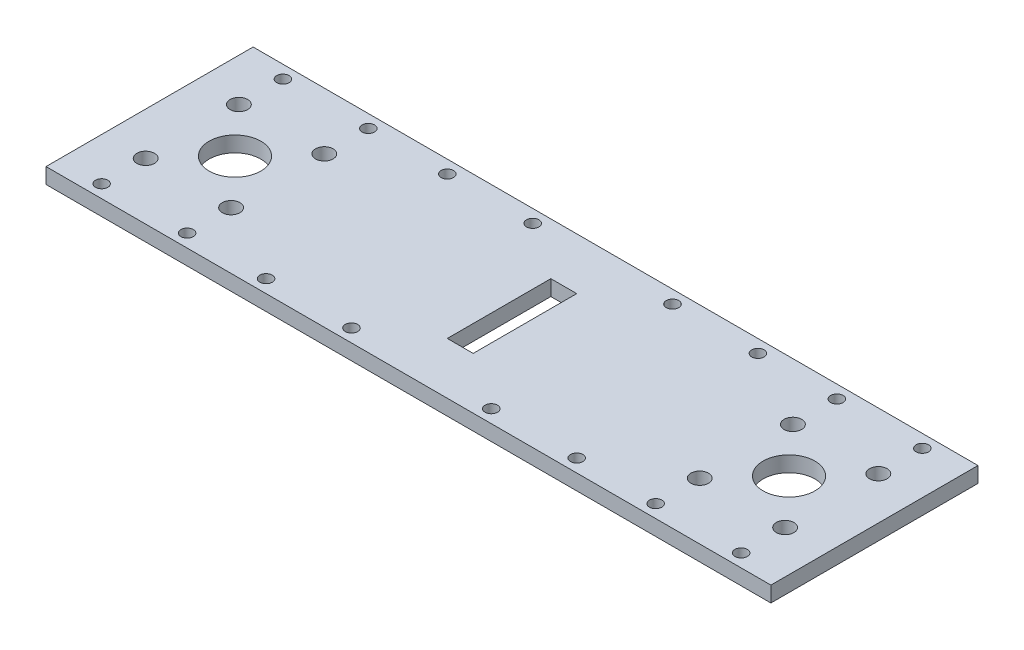
ISO-10303-21;
HEADER;
FILE_DESCRIPTION(('STEP AP214'),'2;1');
FILE_NAME('part.step','',(''),(''),'','','');
FILE_SCHEMA(('AUTOMOTIVE_DESIGN { 1 0 10303 214 1 1 1 1 }'));
ENDSEC;
DATA;
#1=APPLICATION_CONTEXT('core data for automotive mechanical design processes');
#2=APPLICATION_PROTOCOL_DEFINITION('international standard','automotive_design',2000,#1);
#3=PRODUCT_CONTEXT('',#1,'mechanical');
#4=PRODUCT('Part','Part','',(#3));
#5=PRODUCT_RELATED_PRODUCT_CATEGORY('part','',(#4));
#6=PRODUCT_DEFINITION_FORMATION('','',#4);
#7=PRODUCT_DEFINITION_CONTEXT('part definition',#1,'design');
#8=PRODUCT_DEFINITION('design','',#6,#7);
#9=PRODUCT_DEFINITION_SHAPE('','',#8);
#10=(LENGTH_UNIT() NAMED_UNIT(*) SI_UNIT(.MILLI.,.METRE.));
#11=(NAMED_UNIT(*) PLANE_ANGLE_UNIT() SI_UNIT($,.RADIAN.));
#12=(NAMED_UNIT(*) SI_UNIT($,.STERADIAN.) SOLID_ANGLE_UNIT());
#13=UNCERTAINTY_MEASURE_WITH_UNIT(LENGTH_MEASURE(1.E-05),#10,'distance_accuracy_value','');
#14=(GEOMETRIC_REPRESENTATION_CONTEXT(3) GLOBAL_UNCERTAINTY_ASSIGNED_CONTEXT((#13)) GLOBAL_UNIT_ASSIGNED_CONTEXT((#10,
#11,#12)) REPRESENTATION_CONTEXT('',''));
#15=CARTESIAN_POINT('',(0.,0.,0.));
#16=DIRECTION('',(0.,0.,1.));
#17=DIRECTION('',(1.,0.,0.));
#18=AXIS2_PLACEMENT_3D('',#15,#16,#17);
#19=CARTESIAN_POINT('',(0.,3.,-9.99999999999999));
#20=DIRECTION('',(0.,0.,-1.));
#21=DIRECTION('',(-1.,0.,0.));
#22=AXIS2_PLACEMENT_3D('',#19,#20,#21);
#23=PLANE('',#22);
#24=DIRECTION('',(1.,0.,0.));
#25=VECTOR('',#24,1.);
#26=CARTESIAN_POINT('',(0.,0.,-9.99999999999999));
#27=LINE('',#26,#25);
#28=CARTESIAN_POINT('',(-2.50000000000001,0.,-9.99999999999999));
#29=VERTEX_POINT('',#28);
#30=CARTESIAN_POINT('',(2.49999999999999,0.,-9.99999999999999));
#31=VERTEX_POINT('',#30);
#32=EDGE_CURVE('E269',#29,#31,#27,.T.);
#33=ORIENTED_EDGE('',*,*,#32,.T.);
#34=DIRECTION('',(0.,-1.,0.));
#35=VECTOR('',#34,1.);
#36=CARTESIAN_POINT('',(2.49999999999999,3.,-9.99999999999999));
#37=LINE('',#36,#35);
#38=CARTESIAN_POINT('',(2.49999999999999,3.,-9.99999999999999));
#39=VERTEX_POINT('',#38);
#40=EDGE_CURVE('E11',#39,#31,#37,.T.);
#41=ORIENTED_EDGE('',*,*,#40,.F.);
#42=DIRECTION('',(1.,0.,0.));
#43=VECTOR('',#42,1.);
#44=CARTESIAN_POINT('',(0.,3.,-9.99999999999999));
#45=LINE('',#44,#43);
#46=CARTESIAN_POINT('',(-2.50000000000001,3.,-9.99999999999999));
#47=VERTEX_POINT('',#46);
#48=EDGE_CURVE('E129',#47,#39,#45,.T.);
#49=ORIENTED_EDGE('',*,*,#48,.F.);
#50=DIRECTION('',(0.,-1.,0.));
#51=VECTOR('',#50,1.);
#52=CARTESIAN_POINT('',(-2.50000000000001,3.,-9.99999999999999));
#53=LINE('',#52,#51);
#54=EDGE_CURVE('E67',#47,#29,#53,.T.);
#55=ORIENTED_EDGE('',*,*,#54,.T.);
#56=EDGE_LOOP('',(#33,#41,#49,#55));
#57=FACE_BOUND('',#56,.T.);
#58=ADVANCED_FACE('F47',(#57),#23,.F.);
#59=CARTESIAN_POINT('',(2.49999999999999,3.,0.));
#60=DIRECTION('',(1.,0.,0.));
#61=DIRECTION('',(0.,0.,-1.));
#62=AXIS2_PLACEMENT_3D('',#59,#60,#61);
#63=PLANE('',#62);
#64=DIRECTION('',(0.,0.,1.));
#65=VECTOR('',#64,1.);
#66=CARTESIAN_POINT('',(2.49999999999999,0.,0.));
#67=LINE('',#66,#65);
#68=CARTESIAN_POINT('',(2.49999999999999,0.,10.));
#69=VERTEX_POINT('',#68);
#70=EDGE_CURVE('E136',#31,#69,#67,.T.);
#71=ORIENTED_EDGE('',*,*,#70,.T.);
#72=DIRECTION('',(0.,-1.,0.));
#73=VECTOR('',#72,1.);
#74=CARTESIAN_POINT('',(2.49999999999999,3.,10.));
#75=LINE('',#74,#73);
#76=CARTESIAN_POINT('',(2.49999999999999,3.,10.));
#77=VERTEX_POINT('',#76);
#78=EDGE_CURVE('E58',#77,#69,#75,.T.);
#79=ORIENTED_EDGE('',*,*,#78,.F.);
#80=DIRECTION('',(0.,0.,1.));
#81=VECTOR('',#80,1.);
#82=CARTESIAN_POINT('',(2.49999999999999,3.,0.));
#83=LINE('',#82,#81);
#84=EDGE_CURVE('E122',#39,#77,#83,.T.);
#85=ORIENTED_EDGE('',*,*,#84,.F.);
#86=ORIENTED_EDGE('',*,*,#40,.T.);
#87=EDGE_LOOP('',(#71,#79,#85,#86));
#88=FACE_BOUND('',#87,.T.);
#89=ADVANCED_FACE('F135',(#88),#63,.F.);
#90=CARTESIAN_POINT('',(0.,3.,10.));
#91=DIRECTION('',(0.,0.,-1.));
#92=DIRECTION('',(-1.,0.,0.));
#93=AXIS2_PLACEMENT_3D('',#90,#91,#92);
#94=PLANE('',#93);
#95=DIRECTION('',(1.,0.,0.));
#96=VECTOR('',#95,1.);
#97=CARTESIAN_POINT('',(0.,0.,10.));
#98=LINE('',#97,#96);
#99=CARTESIAN_POINT('',(-2.50000000000001,0.,10.));
#100=VERTEX_POINT('',#99);
#101=EDGE_CURVE('E274',#100,#69,#98,.T.);
#102=ORIENTED_EDGE('',*,*,#101,.F.);
#103=DIRECTION('',(0.,-1.,0.));
#104=VECTOR('',#103,1.);
#105=CARTESIAN_POINT('',(-2.50000000000001,3.,10.));
#106=LINE('',#105,#104);
#107=CARTESIAN_POINT('',(-2.50000000000001,3.,10.));
#108=VERTEX_POINT('',#107);
#109=EDGE_CURVE('E93',#108,#100,#106,.T.);
#110=ORIENTED_EDGE('',*,*,#109,.F.);
#111=DIRECTION('',(1.,0.,0.));
#112=VECTOR('',#111,1.);
#113=CARTESIAN_POINT('',(0.,3.,10.));
#114=LINE('',#113,#112);
#115=EDGE_CURVE('E128',#108,#77,#114,.T.);
#116=ORIENTED_EDGE('',*,*,#115,.T.);
#117=ORIENTED_EDGE('',*,*,#78,.T.);
#118=EDGE_LOOP('',(#102,#110,#116,#117));
#119=FACE_BOUND('',#118,.T.);
#120=ADVANCED_FACE('F141',(#119),#94,.T.);
#121=CARTESIAN_POINT('',(0.,3.,20.));
#122=DIRECTION('',(0.,0.,-1.));
#123=DIRECTION('',(-1.,0.,0.));
#124=AXIS2_PLACEMENT_3D('',#121,#122,#123);
#125=PLANE('',#124);
#126=DIRECTION('',(1.,0.,0.));
#127=VECTOR('',#126,1.);
#128=CARTESIAN_POINT('',(0.,0.,20.));
#129=LINE('',#128,#127);
#130=CARTESIAN_POINT('',(-70.,0.,20.));
#131=VERTEX_POINT('',#130);
#132=CARTESIAN_POINT('',(70.,0.,20.));
#133=VERTEX_POINT('',#132);
#134=EDGE_CURVE('E254',#131,#133,#129,.T.);
#135=ORIENTED_EDGE('',*,*,#134,.T.);
#136=DIRECTION('',(0.,-1.,0.));
#137=VECTOR('',#136,1.);
#138=CARTESIAN_POINT('',(70.,3.,20.));
#139=LINE('',#138,#137);
#140=CARTESIAN_POINT('',(70.,3.,20.));
#141=VERTEX_POINT('',#140);
#142=EDGE_CURVE('E51',#141,#133,#139,.T.);
#143=ORIENTED_EDGE('',*,*,#142,.F.);
#144=DIRECTION('',(1.,0.,0.));
#145=VECTOR('',#144,1.);
#146=CARTESIAN_POINT('',(0.,3.,20.));
#147=LINE('',#146,#145);
#148=CARTESIAN_POINT('',(-70.,3.,20.));
#149=VERTEX_POINT('',#148);
#150=EDGE_CURVE('E106',#149,#141,#147,.T.);
#151=ORIENTED_EDGE('',*,*,#150,.F.);
#152=DIRECTION('',(0.,-1.,0.));
#153=VECTOR('',#152,1.);
#154=CARTESIAN_POINT('',(-70.,3.,20.));
#155=LINE('',#154,#153);
#156=EDGE_CURVE('E229',#149,#131,#155,.T.);
#157=ORIENTED_EDGE('',*,*,#156,.T.);
#158=EDGE_LOOP('',(#135,#143,#151,#157));
#159=FACE_BOUND('',#158,.T.);
#160=ADVANCED_FACE('F384',(#159),#125,.F.);
#161=CARTESIAN_POINT('',(70.,3.,0.));
#162=DIRECTION('',(1.,0.,0.));
#163=DIRECTION('',(0.,0.,-1.));
#164=AXIS2_PLACEMENT_3D('',#161,#162,#163);
#165=PLANE('',#164);
#166=DIRECTION('',(0.,0.,1.));
#167=VECTOR('',#166,1.);
#168=CARTESIAN_POINT('',(70.,0.,0.));
#169=LINE('',#168,#167);
#170=CARTESIAN_POINT('',(70.,0.,-20.));
#171=VERTEX_POINT('',#170);
#172=EDGE_CURVE('E258',#171,#133,#169,.T.);
#173=ORIENTED_EDGE('',*,*,#172,.F.);
#174=DIRECTION('',(0.,-1.,0.));
#175=VECTOR('',#174,1.);
#176=CARTESIAN_POINT('',(70.,3.,-20.));
#177=LINE('',#176,#175);
#178=CARTESIAN_POINT('',(70.,3.,-20.));
#179=VERTEX_POINT('',#178);
#180=EDGE_CURVE('E371',#179,#171,#177,.T.);
#181=ORIENTED_EDGE('',*,*,#180,.F.);
#182=DIRECTION('',(0.,0.,1.));
#183=VECTOR('',#182,1.);
#184=CARTESIAN_POINT('',(70.,3.,0.));
#185=LINE('',#184,#183);
#186=EDGE_CURVE('E381',#179,#141,#185,.T.);
#187=ORIENTED_EDGE('',*,*,#186,.T.);
#188=ORIENTED_EDGE('',*,*,#142,.T.);
#189=EDGE_LOOP('',(#173,#181,#187,#188));
#190=FACE_BOUND('',#189,.T.);
#191=ADVANCED_FACE('F380',(#190),#165,.T.);
#192=CARTESIAN_POINT('',(0.,3.,-20.));
#193=DIRECTION('',(0.,0.,-1.));
#194=DIRECTION('',(-1.,0.,0.));
#195=AXIS2_PLACEMENT_3D('',#192,#193,#194);
#196=PLANE('',#195);
#197=DIRECTION('',(1.,0.,0.));
#198=VECTOR('',#197,1.);
#199=CARTESIAN_POINT('',(0.,0.,-20.));
#200=LINE('',#199,#198);
#201=CARTESIAN_POINT('',(-70.,0.,-20.));
#202=VERTEX_POINT('',#201);
#203=EDGE_CURVE('E262',#202,#171,#200,.T.);
#204=ORIENTED_EDGE('',*,*,#203,.F.);
#205=DIRECTION('',(0.,-1.,0.));
#206=VECTOR('',#205,1.);
#207=CARTESIAN_POINT('',(-70.,3.,-20.));
#208=LINE('',#207,#206);
#209=CARTESIAN_POINT('',(-70.,3.,-20.));
#210=VERTEX_POINT('',#209);
#211=EDGE_CURVE('E369',#210,#202,#208,.T.);
#212=ORIENTED_EDGE('',*,*,#211,.F.);
#213=DIRECTION('',(1.,0.,0.));
#214=VECTOR('',#213,1.);
#215=CARTESIAN_POINT('',(0.,3.,-20.));
#216=LINE('',#215,#214);
#217=EDGE_CURVE('E393',#210,#179,#216,.T.);
#218=ORIENTED_EDGE('',*,*,#217,.T.);
#219=ORIENTED_EDGE('',*,*,#180,.T.);
#220=EDGE_LOOP('',(#204,#212,#218,#219));
#221=FACE_BOUND('',#220,.T.);
#222=ADVANCED_FACE('F390',(#221),#196,.T.);
#223=CARTESIAN_POINT('',(45.2499999999998,3.,9.00000000000001));
#224=DIRECTION('',(0.,-1.,0.));
#225=DIRECTION('',(0.,0.,-1.));
#226=AXIS2_PLACEMENT_3D('',#223,#224,#225);
#227=CYLINDRICAL_SURFACE('',#226,1.7);
#228=CARTESIAN_POINT('',(45.2499999999998,3.,9.00000000000001));
#229=DIRECTION('',(0.,1.,0.));
#230=DIRECTION('',(0.,0.,1.));
#231=AXIS2_PLACEMENT_3D('',#228,#229,#230);
#232=CIRCLE('',#231,1.7);
#233=CARTESIAN_POINT('',(45.2499999999998,3.,10.7));
#234=VERTEX_POINT('',#233);
#235=EDGE_CURVE('E221',#234,#234,#232,.F.);
#236=ORIENTED_EDGE('',*,*,#235,.F.);
#237=EDGE_LOOP('',(#236));
#238=FACE_BOUND('',#237,.T.);
#239=CARTESIAN_POINT('',(45.2499999999998,0.,9.00000000000001));
#240=DIRECTION('',(0.,1.,0.));
#241=DIRECTION('',(0.,0.,1.));
#242=AXIS2_PLACEMENT_3D('',#239,#240,#241);
#243=CIRCLE('',#242,1.7);
#244=CARTESIAN_POINT('',(45.2499999999998,0.,10.7));
#245=VERTEX_POINT('',#244);
#246=EDGE_CURVE('E353',#245,#245,#243,.F.);
#247=ORIENTED_EDGE('',*,*,#246,.T.);
#248=EDGE_LOOP('',(#247));
#249=FACE_BOUND('',#248,.T.);
#250=ADVANCED_FACE('F477',(#238,#249),#227,.F.);
#251=CARTESIAN_POINT('',(45.25,3.,-8.99999999999999));
#252=DIRECTION('',(0.,-1.,0.));
#253=DIRECTION('',(0.,0.,-1.));
#254=AXIS2_PLACEMENT_3D('',#251,#252,#253);
#255=CYLINDRICAL_SURFACE('',#254,1.7);
#256=CARTESIAN_POINT('',(45.25,3.,-8.99999999999999));
#257=DIRECTION('',(0.,1.,0.));
#258=DIRECTION('',(0.,0.,1.));
#259=AXIS2_PLACEMENT_3D('',#256,#257,#258);
#260=CIRCLE('',#259,1.7);
#261=CARTESIAN_POINT('',(45.25,3.,-7.29999999999999));
#262=VERTEX_POINT('',#261);
#263=EDGE_CURVE('E217',#262,#262,#260,.F.);
#264=ORIENTED_EDGE('',*,*,#263,.F.);
#265=EDGE_LOOP('',(#264));
#266=FACE_BOUND('',#265,.T.);
#267=CARTESIAN_POINT('',(45.25,0.,-8.99999999999999));
#268=DIRECTION('',(0.,1.,0.));
#269=DIRECTION('',(0.,0.,1.));
#270=AXIS2_PLACEMENT_3D('',#267,#268,#269);
#271=CIRCLE('',#270,1.7);
#272=CARTESIAN_POINT('',(45.25,0.,-7.29999999999999));
#273=VERTEX_POINT('',#272);
#274=EDGE_CURVE('E349',#273,#273,#271,.F.);
#275=ORIENTED_EDGE('',*,*,#274,.T.);
#276=EDGE_LOOP('',(#275));
#277=FACE_BOUND('',#276,.T.);
#278=ADVANCED_FACE('F555',(#266,#277),#255,.F.);
#279=CARTESIAN_POINT('',(53.5,3.,0.));
#280=DIRECTION('',(0.,-1.,0.));
#281=DIRECTION('',(0.,0.,-1.));
#282=AXIS2_PLACEMENT_3D('',#279,#280,#281);
#283=CYLINDRICAL_SURFACE('',#282,5.);
#284=CARTESIAN_POINT('',(53.5,3.,0.));
#285=DIRECTION('',(0.,1.,0.));
#286=DIRECTION('',(0.,0.,1.));
#287=AXIS2_PLACEMENT_3D('',#284,#285,#286);
#288=CIRCLE('',#287,5.);
#289=CARTESIAN_POINT('',(53.5,3.,5.00000000000001));
#290=VERTEX_POINT('',#289);
#291=EDGE_CURVE('E213',#290,#290,#288,.F.);
#292=ORIENTED_EDGE('',*,*,#291,.F.);
#293=EDGE_LOOP('',(#292));
#294=FACE_BOUND('',#293,.T.);
#295=CARTESIAN_POINT('',(53.5,0.,0.));
#296=DIRECTION('',(0.,1.,0.));
#297=DIRECTION('',(0.,0.,1.));
#298=AXIS2_PLACEMENT_3D('',#295,#296,#297);
#299=CIRCLE('',#298,5.);
#300=CARTESIAN_POINT('',(53.5,0.,5.00000000000001));
#301=VERTEX_POINT('',#300);
#302=EDGE_CURVE('E345',#301,#301,#299,.F.);
#303=ORIENTED_EDGE('',*,*,#302,.T.);
#304=EDGE_LOOP('',(#303));
#305=FACE_BOUND('',#304,.T.);
#306=ADVANCED_FACE('F551',(#294,#305),#283,.F.);
#307=CARTESIAN_POINT('',(61.75,3.,-8.99999999999999));
#308=DIRECTION('',(0.,-1.,0.));
#309=DIRECTION('',(0.,0.,-1.));
#310=AXIS2_PLACEMENT_3D('',#307,#308,#309);
#311=CYLINDRICAL_SURFACE('',#310,1.7);
#312=CARTESIAN_POINT('',(61.75,3.,-8.99999999999999));
#313=DIRECTION('',(0.,1.,0.));
#314=DIRECTION('',(0.,0.,1.));
#315=AXIS2_PLACEMENT_3D('',#312,#313,#314);
#316=CIRCLE('',#315,1.7);
#317=CARTESIAN_POINT('',(61.75,3.,-7.29999999999999));
#318=VERTEX_POINT('',#317);
#319=EDGE_CURVE('E209',#318,#318,#316,.F.);
#320=ORIENTED_EDGE('',*,*,#319,.F.);
#321=EDGE_LOOP('',(#320));
#322=FACE_BOUND('',#321,.T.);
#323=CARTESIAN_POINT('',(61.75,0.,-8.99999999999999));
#324=DIRECTION('',(0.,1.,0.));
#325=DIRECTION('',(0.,0.,1.));
#326=AXIS2_PLACEMENT_3D('',#323,#324,#325);
#327=CIRCLE('',#326,1.7);
#328=CARTESIAN_POINT('',(61.75,0.,-7.29999999999999));
#329=VERTEX_POINT('',#328);
#330=EDGE_CURVE('E341',#329,#329,#327,.F.);
#331=ORIENTED_EDGE('',*,*,#330,.T.);
#332=EDGE_LOOP('',(#331));
#333=FACE_BOUND('',#332,.T.);
#334=ADVANCED_FACE('F547',(#322,#333),#311,.F.);
#335=CARTESIAN_POINT('',(61.7499999999998,3.,9.00000000000001));
#336=DIRECTION('',(0.,-1.,0.));
#337=DIRECTION('',(0.,0.,-1.));
#338=AXIS2_PLACEMENT_3D('',#335,#336,#337);
#339=CYLINDRICAL_SURFACE('',#338,1.7);
#340=CARTESIAN_POINT('',(61.7499999999998,3.,9.00000000000001));
#341=DIRECTION('',(0.,1.,0.));
#342=DIRECTION('',(0.,0.,1.));
#343=AXIS2_PLACEMENT_3D('',#340,#341,#342);
#344=CIRCLE('',#343,1.7);
#345=CARTESIAN_POINT('',(61.7499999999998,3.,10.7));
#346=VERTEX_POINT('',#345);
#347=EDGE_CURVE('E205',#346,#346,#344,.F.);
#348=ORIENTED_EDGE('',*,*,#347,.F.);
#349=EDGE_LOOP('',(#348));
#350=FACE_BOUND('',#349,.T.);
#351=CARTESIAN_POINT('',(61.7499999999998,0.,9.00000000000001));
#352=DIRECTION('',(0.,1.,0.));
#353=DIRECTION('',(0.,0.,1.));
#354=AXIS2_PLACEMENT_3D('',#351,#352,#353);
#355=CIRCLE('',#354,1.7);
#356=CARTESIAN_POINT('',(61.7499999999998,0.,10.7));
#357=VERTEX_POINT('',#356);
#358=EDGE_CURVE('E337',#357,#357,#355,.F.);
#359=ORIENTED_EDGE('',*,*,#358,.T.);
#360=EDGE_LOOP('',(#359));
#361=FACE_BOUND('',#360,.T.);
#362=ADVANCED_FACE('F543',(#350,#361),#339,.F.);
#363=CARTESIAN_POINT('',(45.25,3.,17.5));
#364=DIRECTION('',(0.,-1.,0.));
#365=DIRECTION('',(0.,0.,-1.));
#366=AXIS2_PLACEMENT_3D('',#363,#364,#365);
#367=CYLINDRICAL_SURFACE('',#366,1.19756338118872);
#368=CARTESIAN_POINT('',(45.25,3.,17.5));
#369=DIRECTION('',(0.,1.,0.));
#370=DIRECTION('',(0.,0.,1.));
#371=AXIS2_PLACEMENT_3D('',#368,#369,#370);
#372=CIRCLE('',#371,1.19756338118872);
#373=CARTESIAN_POINT('',(45.25,3.,18.6975633811887));
#374=VERTEX_POINT('',#373);
#375=EDGE_CURVE('E201',#374,#374,#372,.F.);
#376=ORIENTED_EDGE('',*,*,#375,.F.);
#377=EDGE_LOOP('',(#376));
#378=FACE_BOUND('',#377,.T.);
#379=CARTESIAN_POINT('',(45.25,0.,17.5));
#380=DIRECTION('',(0.,1.,0.));
#381=DIRECTION('',(0.,0.,1.));
#382=AXIS2_PLACEMENT_3D('',#379,#380,#381);
#383=CIRCLE('',#382,1.19756338118872);
#384=CARTESIAN_POINT('',(45.25,0.,18.6975633811887));
#385=VERTEX_POINT('',#384);
#386=EDGE_CURVE('E333',#385,#385,#383,.F.);
#387=ORIENTED_EDGE('',*,*,#386,.T.);
#388=EDGE_LOOP('',(#387));
#389=FACE_BOUND('',#388,.T.);
#390=ADVANCED_FACE('F539',(#378,#389),#367,.F.);
#391=CARTESIAN_POINT('',(45.25,3.,-17.4999999999999));
#392=DIRECTION('',(0.,-1.,0.));
#393=DIRECTION('',(0.,0.,-1.));
#394=AXIS2_PLACEMENT_3D('',#391,#392,#393);
#395=CYLINDRICAL_SURFACE('',#394,1.19756338118871);
#396=CARTESIAN_POINT('',(45.25,3.,-17.4999999999999));
#397=DIRECTION('',(0.,1.,0.));
#398=DIRECTION('',(0.,0.,1.));
#399=AXIS2_PLACEMENT_3D('',#396,#397,#398);
#400=CIRCLE('',#399,1.19756338118871);
#401=CARTESIAN_POINT('',(45.25,3.,-16.3024366188112));
#402=VERTEX_POINT('',#401);
#403=EDGE_CURVE('E197',#402,#402,#400,.T.);
#404=ORIENTED_EDGE('',*,*,#403,.T.);
#405=EDGE_LOOP('',(#404));
#406=FACE_BOUND('',#405,.T.);
#407=CARTESIAN_POINT('',(45.25,0.,-17.4999999999999));
#408=DIRECTION('',(0.,1.,0.));
#409=DIRECTION('',(0.,0.,1.));
#410=AXIS2_PLACEMENT_3D('',#407,#408,#409);
#411=CIRCLE('',#410,1.19756338118871);
#412=CARTESIAN_POINT('',(45.25,0.,-16.3024366188112));
#413=VERTEX_POINT('',#412);
#414=EDGE_CURVE('E329',#413,#413,#411,.T.);
#415=ORIENTED_EDGE('',*,*,#414,.F.);
#416=EDGE_LOOP('',(#415));
#417=FACE_BOUND('',#416,.T.);
#418=ADVANCED_FACE('F535',(#406,#417),#395,.F.);
#419=CARTESIAN_POINT('',(61.75,3.,-17.4999999999999));
#420=DIRECTION('',(0.,-1.,0.));
#421=DIRECTION('',(0.,0.,-1.));
#422=AXIS2_PLACEMENT_3D('',#419,#420,#421);
#423=CYLINDRICAL_SURFACE('',#422,1.19756338118872);
#424=CARTESIAN_POINT('',(61.75,3.,-17.4999999999999));
#425=DIRECTION('',(0.,1.,0.));
#426=DIRECTION('',(0.,0.,1.));
#427=AXIS2_PLACEMENT_3D('',#424,#425,#426);
#428=CIRCLE('',#427,1.19756338118872);
#429=CARTESIAN_POINT('',(61.75,3.,-16.3024366188111));
#430=VERTEX_POINT('',#429);
#431=EDGE_CURVE('E193',#430,#430,#428,.T.);
#432=ORIENTED_EDGE('',*,*,#431,.T.);
#433=EDGE_LOOP('',(#432));
#434=FACE_BOUND('',#433,.T.);
#435=CARTESIAN_POINT('',(61.75,0.,-17.4999999999999));
#436=DIRECTION('',(0.,1.,0.));
#437=DIRECTION('',(0.,0.,1.));
#438=AXIS2_PLACEMENT_3D('',#435,#436,#437);
#439=CIRCLE('',#438,1.19756338118872);
#440=CARTESIAN_POINT('',(61.75,0.,-16.3024366188111));
#441=VERTEX_POINT('',#440);
#442=EDGE_CURVE('E325',#441,#441,#439,.T.);
#443=ORIENTED_EDGE('',*,*,#442,.F.);
#444=EDGE_LOOP('',(#443));
#445=FACE_BOUND('',#444,.T.);
#446=ADVANCED_FACE('F531',(#434,#445),#423,.F.);
#447=CARTESIAN_POINT('',(-61.75,3.,-17.4999999999999));
#448=DIRECTION('',(0.,-1.,0.));
#449=DIRECTION('',(0.,0.,-1.));
#450=AXIS2_PLACEMENT_3D('',#447,#448,#449);
#451=CYLINDRICAL_SURFACE('',#450,1.19756338118872);
#452=CARTESIAN_POINT('',(-61.75,3.,-17.4999999999999));
#453=DIRECTION('',(0.,1.,0.));
#454=DIRECTION('',(0.,0.,1.));
#455=AXIS2_PLACEMENT_3D('',#452,#453,#454);
#456=CIRCLE('',#455,1.19756338118872);
#457=CARTESIAN_POINT('',(-61.75,3.,-16.3024366188111));
#458=VERTEX_POINT('',#457);
#459=EDGE_CURVE('E189',#458,#458,#456,.F.);
#460=ORIENTED_EDGE('',*,*,#459,.F.);
#461=EDGE_LOOP('',(#460));
#462=FACE_BOUND('',#461,.T.);
#463=CARTESIAN_POINT('',(-61.75,0.,-17.4999999999999));
#464=DIRECTION('',(0.,1.,0.));
#465=DIRECTION('',(0.,0.,1.));
#466=AXIS2_PLACEMENT_3D('',#463,#464,#465);
#467=CIRCLE('',#466,1.19756338118872);
#468=CARTESIAN_POINT('',(-61.75,0.,-16.3024366188111));
#469=VERTEX_POINT('',#468);
#470=EDGE_CURVE('E321',#469,#469,#467,.F.);
#471=ORIENTED_EDGE('',*,*,#470,.T.);
#472=EDGE_LOOP('',(#471));
#473=FACE_BOUND('',#472,.T.);
#474=ADVANCED_FACE('F527',(#462,#473),#451,.F.);
#475=CARTESIAN_POINT('',(-53.5,3.,0.));
#476=DIRECTION('',(0.,-1.,0.));
#477=DIRECTION('',(0.,0.,-1.));
#478=AXIS2_PLACEMENT_3D('',#475,#476,#477);
#479=CYLINDRICAL_SURFACE('',#478,5.);
#480=CARTESIAN_POINT('',(-53.5,3.,0.));
#481=DIRECTION('',(0.,1.,0.));
#482=DIRECTION('',(0.,0.,1.));
#483=AXIS2_PLACEMENT_3D('',#480,#481,#482);
#484=CIRCLE('',#483,5.);
#485=CARTESIAN_POINT('',(-53.5,3.,5.00000000000001));
#486=VERTEX_POINT('',#485);
#487=EDGE_CURVE('E185',#486,#486,#484,.T.);
#488=ORIENTED_EDGE('',*,*,#487,.T.);
#489=EDGE_LOOP('',(#488));
#490=FACE_BOUND('',#489,.T.);
#491=CARTESIAN_POINT('',(-53.5,0.,0.));
#492=DIRECTION('',(0.,1.,0.));
#493=DIRECTION('',(0.,0.,1.));
#494=AXIS2_PLACEMENT_3D('',#491,#492,#493);
#495=CIRCLE('',#494,5.);
#496=CARTESIAN_POINT('',(-53.5,0.,5.00000000000001));
#497=VERTEX_POINT('',#496);
#498=EDGE_CURVE('E317',#497,#497,#495,.T.);
#499=ORIENTED_EDGE('',*,*,#498,.F.);
#500=EDGE_LOOP('',(#499));
#501=FACE_BOUND('',#500,.T.);
#502=ADVANCED_FACE('F523',(#490,#501),#479,.F.);
#503=CARTESIAN_POINT('',(-61.75,3.,-8.99999999999999));
#504=DIRECTION('',(0.,-1.,0.));
#505=DIRECTION('',(0.,0.,-1.));
#506=AXIS2_PLACEMENT_3D('',#503,#504,#505);
#507=CYLINDRICAL_SURFACE('',#506,1.7);
#508=CARTESIAN_POINT('',(-61.75,3.,-8.99999999999999));
#509=DIRECTION('',(0.,1.,0.));
#510=DIRECTION('',(0.,0.,1.));
#511=AXIS2_PLACEMENT_3D('',#508,#509,#510);
#512=CIRCLE('',#511,1.7);
#513=CARTESIAN_POINT('',(-61.75,3.,-7.29999999999999));
#514=VERTEX_POINT('',#513);
#515=EDGE_CURVE('E181',#514,#514,#512,.T.);
#516=ORIENTED_EDGE('',*,*,#515,.T.);
#517=EDGE_LOOP('',(#516));
#518=FACE_BOUND('',#517,.T.);
#519=CARTESIAN_POINT('',(-61.75,0.,-8.99999999999999));
#520=DIRECTION('',(0.,1.,0.));
#521=DIRECTION('',(0.,0.,1.));
#522=AXIS2_PLACEMENT_3D('',#519,#520,#521);
#523=CIRCLE('',#522,1.7);
#524=CARTESIAN_POINT('',(-61.75,0.,-7.29999999999999));
#525=VERTEX_POINT('',#524);
#526=EDGE_CURVE('E313',#525,#525,#523,.T.);
#527=ORIENTED_EDGE('',*,*,#526,.F.);
#528=EDGE_LOOP('',(#527));
#529=FACE_BOUND('',#528,.T.);
#530=ADVANCED_FACE('F519',(#518,#529),#507,.F.);
#531=CARTESIAN_POINT('',(-61.75,3.,17.5));
#532=DIRECTION('',(0.,-1.,0.));
#533=DIRECTION('',(0.,0.,-1.));
#534=AXIS2_PLACEMENT_3D('',#531,#532,#533);
#535=CYLINDRICAL_SURFACE('',#534,1.19756338118872);
#536=CARTESIAN_POINT('',(-61.75,3.,17.5));
#537=DIRECTION('',(0.,1.,0.));
#538=DIRECTION('',(0.,0.,1.));
#539=AXIS2_PLACEMENT_3D('',#536,#537,#538);
#540=CIRCLE('',#539,1.19756338118872);
#541=CARTESIAN_POINT('',(-61.75,3.,18.6975633811887));
#542=VERTEX_POINT('',#541);
#543=EDGE_CURVE('E177',#542,#542,#540,.T.);
#544=ORIENTED_EDGE('',*,*,#543,.T.);
#545=EDGE_LOOP('',(#544));
#546=FACE_BOUND('',#545,.T.);
#547=CARTESIAN_POINT('',(-61.75,0.,17.5));
#548=DIRECTION('',(0.,1.,0.));
#549=DIRECTION('',(0.,0.,1.));
#550=AXIS2_PLACEMENT_3D('',#547,#548,#549);
#551=CIRCLE('',#550,1.19756338118872);
#552=CARTESIAN_POINT('',(-61.75,0.,18.6975633811887));
#553=VERTEX_POINT('',#552);
#554=EDGE_CURVE('E309',#553,#553,#551,.T.);
#555=ORIENTED_EDGE('',*,*,#554,.F.);
#556=EDGE_LOOP('',(#555));
#557=FACE_BOUND('',#556,.T.);
#558=ADVANCED_FACE('F515',(#546,#557),#535,.F.);
#559=CARTESIAN_POINT('',(-45.25,3.,-8.99999999999999));
#560=DIRECTION('',(0.,-1.,0.));
#561=DIRECTION('',(0.,0.,-1.));
#562=AXIS2_PLACEMENT_3D('',#559,#560,#561);
#563=CYLINDRICAL_SURFACE('',#562,1.7);
#564=CARTESIAN_POINT('',(-45.25,3.,-8.99999999999999));
#565=DIRECTION('',(0.,1.,0.));
#566=DIRECTION('',(0.,0.,1.));
#567=AXIS2_PLACEMENT_3D('',#564,#565,#566);
#568=CIRCLE('',#567,1.7);
#569=CARTESIAN_POINT('',(-45.25,3.,-7.29999999999999));
#570=VERTEX_POINT('',#569);
#571=EDGE_CURVE('E173',#570,#570,#568,.T.);
#572=ORIENTED_EDGE('',*,*,#571,.T.);
#573=EDGE_LOOP('',(#572));
#574=FACE_BOUND('',#573,.T.);
#575=CARTESIAN_POINT('',(-45.25,0.,-8.99999999999999));
#576=DIRECTION('',(0.,1.,0.));
#577=DIRECTION('',(0.,0.,1.));
#578=AXIS2_PLACEMENT_3D('',#575,#576,#577);
#579=CIRCLE('',#578,1.7);
#580=CARTESIAN_POINT('',(-45.25,0.,-7.29999999999999));
#581=VERTEX_POINT('',#580);
#582=EDGE_CURVE('E305',#581,#581,#579,.T.);
#583=ORIENTED_EDGE('',*,*,#582,.F.);
#584=EDGE_LOOP('',(#583));
#585=FACE_BOUND('',#584,.T.);
#586=ADVANCED_FACE('F511',(#574,#585),#563,.F.);
#587=CARTESIAN_POINT('',(-45.2499999999998,3.,9.00000000000001));
#588=DIRECTION('',(0.,-1.,0.));
#589=DIRECTION('',(0.,0.,-1.));
#590=AXIS2_PLACEMENT_3D('',#587,#588,#589);
#591=CYLINDRICAL_SURFACE('',#590,1.7);
#592=CARTESIAN_POINT('',(-45.2499999999998,3.,9.00000000000001));
#593=DIRECTION('',(0.,1.,0.));
#594=DIRECTION('',(0.,0.,1.));
#595=AXIS2_PLACEMENT_3D('',#592,#593,#594);
#596=CIRCLE('',#595,1.7);
#597=CARTESIAN_POINT('',(-45.2499999999998,3.,10.7));
#598=VERTEX_POINT('',#597);
#599=EDGE_CURVE('E169',#598,#598,#596,.T.);
#600=ORIENTED_EDGE('',*,*,#599,.T.);
#601=EDGE_LOOP('',(#600));
#602=FACE_BOUND('',#601,.T.);
#603=CARTESIAN_POINT('',(-45.2499999999998,0.,9.00000000000001));
#604=DIRECTION('',(0.,1.,0.));
#605=DIRECTION('',(0.,0.,1.));
#606=AXIS2_PLACEMENT_3D('',#603,#604,#605);
#607=CIRCLE('',#606,1.7);
#608=CARTESIAN_POINT('',(-45.2499999999998,0.,10.7));
#609=VERTEX_POINT('',#608);
#610=EDGE_CURVE('E301',#609,#609,#607,.T.);
#611=ORIENTED_EDGE('',*,*,#610,.F.);
#612=EDGE_LOOP('',(#611));
#613=FACE_BOUND('',#612,.T.);
#614=ADVANCED_FACE('F507',(#602,#613),#591,.F.);
#615=CARTESIAN_POINT('',(-61.7499999999998,3.,9.00000000000001));
#616=DIRECTION('',(0.,-1.,0.));
#617=DIRECTION('',(0.,0.,-1.));
#618=AXIS2_PLACEMENT_3D('',#615,#616,#617);
#619=CYLINDRICAL_SURFACE('',#618,1.7);
#620=CARTESIAN_POINT('',(-61.7499999999998,3.,9.00000000000001));
#621=DIRECTION('',(0.,1.,0.));
#622=DIRECTION('',(0.,0.,1.));
#623=AXIS2_PLACEMENT_3D('',#620,#621,#622);
#624=CIRCLE('',#623,1.7);
#625=CARTESIAN_POINT('',(-61.7499999999998,3.,10.7));
#626=VERTEX_POINT('',#625);
#627=EDGE_CURVE('E165',#626,#626,#624,.T.);
#628=ORIENTED_EDGE('',*,*,#627,.T.);
#629=EDGE_LOOP('',(#628));
#630=FACE_BOUND('',#629,.T.);
#631=CARTESIAN_POINT('',(-61.7499999999998,0.,9.00000000000001));
#632=DIRECTION('',(0.,1.,0.));
#633=DIRECTION('',(0.,0.,1.));
#634=AXIS2_PLACEMENT_3D('',#631,#632,#633);
#635=CIRCLE('',#634,1.7);
#636=CARTESIAN_POINT('',(-61.7499999999998,0.,10.7));
#637=VERTEX_POINT('',#636);
#638=EDGE_CURVE('E297',#637,#637,#635,.T.);
#639=ORIENTED_EDGE('',*,*,#638,.F.);
#640=EDGE_LOOP('',(#639));
#641=FACE_BOUND('',#640,.T.);
#642=ADVANCED_FACE('F503',(#630,#641),#619,.F.);
#643=CARTESIAN_POINT('',(-45.25,3.,17.5));
#644=DIRECTION('',(0.,-1.,0.));
#645=DIRECTION('',(0.,0.,-1.));
#646=AXIS2_PLACEMENT_3D('',#643,#644,#645);
#647=CYLINDRICAL_SURFACE('',#646,1.19756338118872);
#648=CARTESIAN_POINT('',(-45.25,3.,17.5));
#649=DIRECTION('',(0.,1.,0.));
#650=DIRECTION('',(0.,0.,1.));
#651=AXIS2_PLACEMENT_3D('',#648,#649,#650);
#652=CIRCLE('',#651,1.19756338118872);
#653=CARTESIAN_POINT('',(-45.25,3.,18.6975633811887));
#654=VERTEX_POINT('',#653);
#655=EDGE_CURVE('E161',#654,#654,#652,.T.);
#656=ORIENTED_EDGE('',*,*,#655,.T.);
#657=EDGE_LOOP('',(#656));
#658=FACE_BOUND('',#657,.T.);
#659=CARTESIAN_POINT('',(-45.25,0.,17.5));
#660=DIRECTION('',(0.,1.,0.));
#661=DIRECTION('',(0.,0.,1.));
#662=AXIS2_PLACEMENT_3D('',#659,#660,#661);
#663=CIRCLE('',#662,1.19756338118872);
#664=CARTESIAN_POINT('',(-45.25,0.,18.6975633811887));
#665=VERTEX_POINT('',#664);
#666=EDGE_CURVE('E293',#665,#665,#663,.T.);
#667=ORIENTED_EDGE('',*,*,#666,.F.);
#668=EDGE_LOOP('',(#667));
#669=FACE_BOUND('',#668,.T.);
#670=ADVANCED_FACE('F499',(#658,#669),#647,.F.);
#671=CARTESIAN_POINT('',(-45.25,3.,-17.4999999999999));
#672=DIRECTION('',(0.,-1.,0.));
#673=DIRECTION('',(0.,0.,-1.));
#674=AXIS2_PLACEMENT_3D('',#671,#672,#673);
#675=CYLINDRICAL_SURFACE('',#674,1.19756338118871);
#676=CARTESIAN_POINT('',(-45.25,3.,-17.4999999999999));
#677=DIRECTION('',(0.,1.,0.));
#678=DIRECTION('',(0.,0.,1.));
#679=AXIS2_PLACEMENT_3D('',#676,#677,#678);
#680=CIRCLE('',#679,1.19756338118871);
#681=CARTESIAN_POINT('',(-45.25,3.,-16.3024366188112));
#682=VERTEX_POINT('',#681);
#683=EDGE_CURVE('E157',#682,#682,#680,.F.);
#684=ORIENTED_EDGE('',*,*,#683,.F.);
#685=EDGE_LOOP('',(#684));
#686=FACE_BOUND('',#685,.T.);
#687=CARTESIAN_POINT('',(-45.25,0.,-17.4999999999999));
#688=DIRECTION('',(0.,1.,0.));
#689=DIRECTION('',(0.,0.,1.));
#690=AXIS2_PLACEMENT_3D('',#687,#688,#689);
#691=CIRCLE('',#690,1.19756338118871);
#692=CARTESIAN_POINT('',(-45.25,0.,-16.3024366188112));
#693=VERTEX_POINT('',#692);
#694=EDGE_CURVE('E289',#693,#693,#691,.F.);
#695=ORIENTED_EDGE('',*,*,#694,.T.);
#696=EDGE_LOOP('',(#695));
#697=FACE_BOUND('',#696,.T.);
#698=ADVANCED_FACE('F495',(#686,#697),#675,.F.);
#699=CARTESIAN_POINT('',(30.,3.,17.5));
#700=DIRECTION('',(0.,-1.,0.));
#701=DIRECTION('',(0.,0.,-1.));
#702=AXIS2_PLACEMENT_3D('',#699,#700,#701);
#703=CYLINDRICAL_SURFACE('',#702,1.2);
#704=CARTESIAN_POINT('',(30.,3.,17.5));
#705=DIRECTION('',(0.,1.,0.));
#706=DIRECTION('',(0.,0.,1.));
#707=AXIS2_PLACEMENT_3D('',#704,#705,#706);
#708=CIRCLE('',#707,1.2);
#709=CARTESIAN_POINT('',(30.,3.,18.7));
#710=VERTEX_POINT('',#709);
#711=EDGE_CURVE('E153',#710,#710,#708,.F.);
#712=ORIENTED_EDGE('',*,*,#711,.F.);
#713=EDGE_LOOP('',(#712));
#714=FACE_BOUND('',#713,.T.);
#715=CARTESIAN_POINT('',(30.,0.,17.5));
#716=DIRECTION('',(0.,1.,0.));
#717=DIRECTION('',(0.,0.,1.));
#718=AXIS2_PLACEMENT_3D('',#715,#716,#717);
#719=CIRCLE('',#718,1.2);
#720=CARTESIAN_POINT('',(30.,0.,18.7));
#721=VERTEX_POINT('',#720);
#722=EDGE_CURVE('E285',#721,#721,#719,.F.);
#723=ORIENTED_EDGE('',*,*,#722,.T.);
#724=EDGE_LOOP('',(#723));
#725=FACE_BOUND('',#724,.T.);
#726=ADVANCED_FACE('F491',(#714,#725),#703,.F.);
#727=CARTESIAN_POINT('',(-13.5,3.,-17.5));
#728=DIRECTION('',(0.,-1.,0.));
#729=DIRECTION('',(0.,0.,-1.));
#730=AXIS2_PLACEMENT_3D('',#727,#728,#729);
#731=CYLINDRICAL_SURFACE('',#730,1.2);
#732=CARTESIAN_POINT('',(-13.5,3.,-17.5));
#733=DIRECTION('',(0.,1.,0.));
#734=DIRECTION('',(0.,0.,1.));
#735=AXIS2_PLACEMENT_3D('',#732,#733,#734);
#736=CIRCLE('',#735,1.2);
#737=CARTESIAN_POINT('',(-13.5,3.,-16.3));
#738=VERTEX_POINT('',#737);
#739=EDGE_CURVE('E146',#738,#738,#736,.F.);
#740=ORIENTED_EDGE('',*,*,#739,.F.);
#741=EDGE_LOOP('',(#740));
#742=FACE_BOUND('',#741,.T.);
#743=CARTESIAN_POINT('',(-13.5,0.,-17.5));
#744=DIRECTION('',(0.,1.,0.));
#745=DIRECTION('',(0.,0.,1.));
#746=AXIS2_PLACEMENT_3D('',#743,#744,#745);
#747=CIRCLE('',#746,1.2);
#748=CARTESIAN_POINT('',(-13.5,0.,-16.3));
#749=VERTEX_POINT('',#748);
#750=EDGE_CURVE('E281',#749,#749,#747,.F.);
#751=ORIENTED_EDGE('',*,*,#750,.T.);
#752=EDGE_LOOP('',(#751));
#753=FACE_BOUND('',#752,.T.);
#754=ADVANCED_FACE('F488',(#742,#753),#731,.F.);
#755=CARTESIAN_POINT('',(-2.50000000000001,3.,0.));
#756=DIRECTION('',(1.,0.,0.));
#757=DIRECTION('',(0.,0.,-1.));
#758=AXIS2_PLACEMENT_3D('',#755,#756,#757);
#759=PLANE('',#758);
#760=DIRECTION('',(0.,0.,1.));
#761=VECTOR('',#760,1.);
#762=CARTESIAN_POINT('',(-2.50000000000001,0.,0.));
#763=LINE('',#762,#761);
#764=EDGE_CURVE('E277',#29,#100,#763,.T.);
#765=ORIENTED_EDGE('',*,*,#764,.F.);
#766=ORIENTED_EDGE('',*,*,#54,.F.);
#767=DIRECTION('',(0.,0.,1.));
#768=VECTOR('',#767,1.);
#769=CARTESIAN_POINT('',(-2.50000000000001,3.,0.));
#770=LINE('',#769,#768);
#771=EDGE_CURVE('E143',#47,#108,#770,.T.);
#772=ORIENTED_EDGE('',*,*,#771,.T.);
#773=ORIENTED_EDGE('',*,*,#109,.T.);
#774=EDGE_LOOP('',(#765,#766,#772,#773));
#775=FACE_BOUND('',#774,.T.);
#776=ADVANCED_FACE('F464',(#775),#759,.T.);
#777=CARTESIAN_POINT('',(-70.,3.,0.));
#778=DIRECTION('',(1.,0.,0.));
#779=DIRECTION('',(0.,0.,-1.));
#780=AXIS2_PLACEMENT_3D('',#777,#778,#779);
#781=PLANE('',#780);
#782=DIRECTION('',(0.,0.,1.));
#783=VECTOR('',#782,1.);
#784=CARTESIAN_POINT('',(-70.,0.,0.));
#785=LINE('',#784,#783);
#786=EDGE_CURVE('E266',#202,#131,#785,.T.);
#787=ORIENTED_EDGE('',*,*,#786,.T.);
#788=ORIENTED_EDGE('',*,*,#156,.F.);
#789=DIRECTION('',(0.,0.,1.));
#790=VECTOR('',#789,1.);
#791=CARTESIAN_POINT('',(-70.,3.,0.));
#792=LINE('',#791,#790);
#793=EDGE_CURVE('E395',#210,#149,#792,.T.);
#794=ORIENTED_EDGE('',*,*,#793,.F.);
#795=ORIENTED_EDGE('',*,*,#211,.T.);
#796=EDGE_LOOP('',(#787,#788,#794,#795));
#797=FACE_BOUND('',#796,.T.);
#798=ADVANCED_FACE('F396',(#797),#781,.F.);
#799=CARTESIAN_POINT('',(-30.,3.,17.5));
#800=DIRECTION('',(0.,-1.,0.));
#801=DIRECTION('',(0.,0.,-1.));
#802=AXIS2_PLACEMENT_3D('',#799,#800,#801);
#803=CYLINDRICAL_SURFACE('',#802,1.2);
#804=CARTESIAN_POINT('',(-30.,3.,17.5));
#805=DIRECTION('',(0.,1.,0.));
#806=DIRECTION('',(0.,0.,1.));
#807=AXIS2_PLACEMENT_3D('',#804,#805,#806);
#808=CIRCLE('',#807,1.2);
#809=CARTESIAN_POINT('',(-30.,3.,18.7));
#810=VERTEX_POINT('',#809);
#811=EDGE_CURVE('E407',#810,#810,#808,.T.);
#812=ORIENTED_EDGE('',*,*,#811,.T.);
#813=EDGE_LOOP('',(#812));
#814=FACE_BOUND('',#813,.T.);
#815=CARTESIAN_POINT('',(-30.,0.,17.5));
#816=DIRECTION('',(0.,1.,0.));
#817=DIRECTION('',(0.,0.,1.));
#818=AXIS2_PLACEMENT_3D('',#815,#816,#817);
#819=CIRCLE('',#818,1.2);
#820=CARTESIAN_POINT('',(-30.,0.,18.7));
#821=VERTEX_POINT('',#820);
#822=EDGE_CURVE('E250',#821,#821,#819,.T.);
#823=ORIENTED_EDGE('',*,*,#822,.F.);
#824=EDGE_LOOP('',(#823));
#825=FACE_BOUND('',#824,.T.);
#826=ADVANCED_FACE('F452',(#814,#825),#803,.F.);
#827=CARTESIAN_POINT('',(-13.5,3.,17.5));
#828=DIRECTION('',(0.,-1.,0.));
#829=DIRECTION('',(0.,0.,-1.));
#830=AXIS2_PLACEMENT_3D('',#827,#828,#829);
#831=CYLINDRICAL_SURFACE('',#830,1.2);
#832=CARTESIAN_POINT('',(-13.5,3.,17.5));
#833=DIRECTION('',(0.,1.,0.));
#834=DIRECTION('',(0.,0.,1.));
#835=AXIS2_PLACEMENT_3D('',#832,#833,#834);
#836=CIRCLE('',#835,1.2);
#837=CARTESIAN_POINT('',(-13.5,3.,18.7));
#838=VERTEX_POINT('',#837);
#839=EDGE_CURVE('E411',#838,#838,#836,.T.);
#840=ORIENTED_EDGE('',*,*,#839,.T.);
#841=EDGE_LOOP('',(#840));
#842=FACE_BOUND('',#841,.T.);
#843=CARTESIAN_POINT('',(-13.5,0.,17.5));
#844=DIRECTION('',(0.,1.,0.));
#845=DIRECTION('',(0.,0.,1.));
#846=AXIS2_PLACEMENT_3D('',#843,#844,#845);
#847=CIRCLE('',#846,1.2);
#848=CARTESIAN_POINT('',(-13.5,0.,18.7));
#849=VERTEX_POINT('',#848);
#850=EDGE_CURVE('E246',#849,#849,#847,.T.);
#851=ORIENTED_EDGE('',*,*,#850,.F.);
#852=EDGE_LOOP('',(#851));
#853=FACE_BOUND('',#852,.T.);
#854=ADVANCED_FACE('F454',(#842,#853),#831,.F.);
#855=CARTESIAN_POINT('',(-30.,3.,-17.5));
#856=DIRECTION('',(0.,-1.,0.));
#857=DIRECTION('',(0.,0.,-1.));
#858=AXIS2_PLACEMENT_3D('',#855,#856,#857);
#859=CYLINDRICAL_SURFACE('',#858,1.2);
#860=CARTESIAN_POINT('',(-30.,3.,-17.5));
#861=DIRECTION('',(0.,1.,0.));
#862=DIRECTION('',(0.,0.,1.));
#863=AXIS2_PLACEMENT_3D('',#860,#861,#862);
#864=CIRCLE('',#863,1.2);
#865=CARTESIAN_POINT('',(-30.,3.,-16.3));
#866=VERTEX_POINT('',#865);
#867=EDGE_CURVE('E415',#866,#866,#864,.F.);
#868=ORIENTED_EDGE('',*,*,#867,.F.);
#869=EDGE_LOOP('',(#868));
#870=FACE_BOUND('',#869,.T.);
#871=CARTESIAN_POINT('',(-30.,0.,-17.5));
#872=DIRECTION('',(0.,1.,0.));
#873=DIRECTION('',(0.,0.,1.));
#874=AXIS2_PLACEMENT_3D('',#871,#872,#873);
#875=CIRCLE('',#874,1.2);
#876=CARTESIAN_POINT('',(-30.,0.,-16.3));
#877=VERTEX_POINT('',#876);
#878=EDGE_CURVE('E242',#877,#877,#875,.F.);
#879=ORIENTED_EDGE('',*,*,#878,.T.);
#880=EDGE_LOOP('',(#879));
#881=FACE_BOUND('',#880,.T.);
#882=ADVANCED_FACE('F461',(#870,#881),#859,.F.);
#883=CARTESIAN_POINT('',(30.,3.,-17.5));
#884=DIRECTION('',(0.,-1.,0.));
#885=DIRECTION('',(0.,0.,-1.));
#886=AXIS2_PLACEMENT_3D('',#883,#884,#885);
#887=CYLINDRICAL_SURFACE('',#886,1.2);
#888=CARTESIAN_POINT('',(30.,3.,-17.5));
#889=DIRECTION('',(0.,1.,0.));
#890=DIRECTION('',(0.,0.,1.));
#891=AXIS2_PLACEMENT_3D('',#888,#889,#890);
#892=CIRCLE('',#891,1.2);
#893=CARTESIAN_POINT('',(30.,3.,-16.3));
#894=VERTEX_POINT('',#893);
#895=EDGE_CURVE('E419',#894,#894,#892,.T.);
#896=ORIENTED_EDGE('',*,*,#895,.T.);
#897=EDGE_LOOP('',(#896));
#898=FACE_BOUND('',#897,.T.);
#899=CARTESIAN_POINT('',(30.,0.,-17.5));
#900=DIRECTION('',(0.,1.,0.));
#901=DIRECTION('',(0.,0.,1.));
#902=AXIS2_PLACEMENT_3D('',#899,#900,#901);
#903=CIRCLE('',#902,1.2);
#904=CARTESIAN_POINT('',(30.,0.,-16.3));
#905=VERTEX_POINT('',#904);
#906=EDGE_CURVE('E238',#905,#905,#903,.T.);
#907=ORIENTED_EDGE('',*,*,#906,.F.);
#908=EDGE_LOOP('',(#907));
#909=FACE_BOUND('',#908,.T.);
#910=ADVANCED_FACE('F605',(#898,#909),#887,.F.);
#911=CARTESIAN_POINT('',(13.5,3.,-17.5));
#912=DIRECTION('',(0.,-1.,0.));
#913=DIRECTION('',(0.,0.,-1.));
#914=AXIS2_PLACEMENT_3D('',#911,#912,#913);
#915=CYLINDRICAL_SURFACE('',#914,1.2);
#916=CARTESIAN_POINT('',(13.5,3.,-17.5));
#917=DIRECTION('',(0.,1.,0.));
#918=DIRECTION('',(0.,0.,1.));
#919=AXIS2_PLACEMENT_3D('',#916,#917,#918);
#920=CIRCLE('',#919,1.2);
#921=CARTESIAN_POINT('',(13.5,3.,-16.3));
#922=VERTEX_POINT('',#921);
#923=EDGE_CURVE('E423',#922,#922,#920,.T.);
#924=ORIENTED_EDGE('',*,*,#923,.T.);
#925=EDGE_LOOP('',(#924));
#926=FACE_BOUND('',#925,.T.);
#927=CARTESIAN_POINT('',(13.5,0.,-17.5));
#928=DIRECTION('',(0.,1.,0.));
#929=DIRECTION('',(0.,0.,1.));
#930=AXIS2_PLACEMENT_3D('',#927,#928,#929);
#931=CIRCLE('',#930,1.2);
#932=CARTESIAN_POINT('',(13.5,0.,-16.3));
#933=VERTEX_POINT('',#932);
#934=EDGE_CURVE('E234',#933,#933,#931,.T.);
#935=ORIENTED_EDGE('',*,*,#934,.F.);
#936=EDGE_LOOP('',(#935));
#937=FACE_BOUND('',#936,.T.);
#938=ADVANCED_FACE('F436',(#926,#937),#915,.F.);
#939=CARTESIAN_POINT('',(13.5,3.,17.5));
#940=DIRECTION('',(0.,-1.,0.));
#941=DIRECTION('',(0.,0.,-1.));
#942=AXIS2_PLACEMENT_3D('',#939,#940,#941);
#943=CYLINDRICAL_SURFACE('',#942,1.2);
#944=CARTESIAN_POINT('',(13.5,3.,17.5));
#945=DIRECTION('',(0.,1.,0.));
#946=DIRECTION('',(0.,0.,1.));
#947=AXIS2_PLACEMENT_3D('',#944,#945,#946);
#948=CIRCLE('',#947,1.2);
#949=CARTESIAN_POINT('',(13.5,3.,18.7));
#950=VERTEX_POINT('',#949);
#951=EDGE_CURVE('E361',#950,#950,#948,.F.);
#952=ORIENTED_EDGE('',*,*,#951,.F.);
#953=EDGE_LOOP('',(#952));
#954=FACE_BOUND('',#953,.T.);
#955=CARTESIAN_POINT('',(13.5,0.,17.5));
#956=DIRECTION('',(0.,1.,0.));
#957=DIRECTION('',(0.,0.,1.));
#958=AXIS2_PLACEMENT_3D('',#955,#956,#957);
#959=CIRCLE('',#958,1.2);
#960=CARTESIAN_POINT('',(13.5,0.,18.7));
#961=VERTEX_POINT('',#960);
#962=EDGE_CURVE('E230',#961,#961,#959,.F.);
#963=ORIENTED_EDGE('',*,*,#962,.T.);
#964=EDGE_LOOP('',(#963));
#965=FACE_BOUND('',#964,.T.);
#966=ADVANCED_FACE('F49',(#954,#965),#943,.F.);
#967=CARTESIAN_POINT('',(61.75,3.,17.5));
#968=DIRECTION('',(0.,-1.,0.));
#969=DIRECTION('',(0.,0.,-1.));
#970=AXIS2_PLACEMENT_3D('',#967,#968,#969);
#971=CYLINDRICAL_SURFACE('',#970,1.19756338118872);
#972=CARTESIAN_POINT('',(61.75,3.,17.5));
#973=DIRECTION('',(0.,1.,0.));
#974=DIRECTION('',(0.,0.,1.));
#975=AXIS2_PLACEMENT_3D('',#972,#973,#974);
#976=CIRCLE('',#975,1.19756338118872);
#977=CARTESIAN_POINT('',(61.75,3.,18.6975633811887));
#978=VERTEX_POINT('',#977);
#979=EDGE_CURVE('E225',#978,#978,#976,.F.);
#980=ORIENTED_EDGE('',*,*,#979,.F.);
#981=EDGE_LOOP('',(#980));
#982=FACE_BOUND('',#981,.T.);
#983=CARTESIAN_POINT('',(61.75,0.,17.5));
#984=DIRECTION('',(0.,1.,0.));
#985=DIRECTION('',(0.,0.,1.));
#986=AXIS2_PLACEMENT_3D('',#983,#984,#985);
#987=CIRCLE('',#986,1.19756338118872);
#988=CARTESIAN_POINT('',(61.75,0.,18.6975633811887));
#989=VERTEX_POINT('',#988);
#990=EDGE_CURVE('E357',#989,#989,#987,.F.);
#991=ORIENTED_EDGE('',*,*,#990,.T.);
#992=EDGE_LOOP('',(#991));
#993=FACE_BOUND('',#992,.T.);
#994=ADVANCED_FACE('F435',(#982,#993),#971,.F.);
#995=CARTESIAN_POINT('',(0.,3.,0.));
#996=DIRECTION('',(0.,1.,0.));
#997=DIRECTION('',(0.,0.,1.));
#998=AXIS2_PLACEMENT_3D('',#995,#996,#997);
#999=PLANE('',#998);
#1000=ORIENTED_EDGE('',*,*,#951,.T.);
#1001=EDGE_LOOP('',(#1000));
#1002=FACE_BOUND('',#1001,.T.);
#1003=ORIENTED_EDGE('',*,*,#923,.F.);
#1004=EDGE_LOOP('',(#1003));
#1005=FACE_BOUND('',#1004,.T.);
#1006=ORIENTED_EDGE('',*,*,#895,.F.);
#1007=EDGE_LOOP('',(#1006));
#1008=FACE_BOUND('',#1007,.T.);
#1009=ORIENTED_EDGE('',*,*,#867,.T.);
#1010=EDGE_LOOP('',(#1009));
#1011=FACE_BOUND('',#1010,.T.);
#1012=ORIENTED_EDGE('',*,*,#839,.F.);
#1013=EDGE_LOOP('',(#1012));
#1014=FACE_BOUND('',#1013,.T.);
#1015=ORIENTED_EDGE('',*,*,#811,.F.);
#1016=EDGE_LOOP('',(#1015));
#1017=FACE_BOUND('',#1016,.T.);
#1018=ORIENTED_EDGE('',*,*,#150,.T.);
#1019=ORIENTED_EDGE('',*,*,#186,.F.);
#1020=ORIENTED_EDGE('',*,*,#217,.F.);
#1021=ORIENTED_EDGE('',*,*,#793,.T.);
#1022=EDGE_LOOP('',(#1018,#1019,#1020,#1021));
#1023=FACE_BOUND('',#1022,.T.);
#1024=ORIENTED_EDGE('',*,*,#48,.T.);
#1025=ORIENTED_EDGE('',*,*,#84,.T.);
#1026=ORIENTED_EDGE('',*,*,#115,.F.);
#1027=ORIENTED_EDGE('',*,*,#771,.F.);
#1028=EDGE_LOOP('',(#1024,#1025,#1026,#1027));
#1029=FACE_BOUND('',#1028,.T.);
#1030=ORIENTED_EDGE('',*,*,#739,.T.);
#1031=EDGE_LOOP('',(#1030));
#1032=FACE_BOUND('',#1031,.T.);
#1033=ORIENTED_EDGE('',*,*,#711,.T.);
#1034=EDGE_LOOP('',(#1033));
#1035=FACE_BOUND('',#1034,.T.);
#1036=ORIENTED_EDGE('',*,*,#683,.T.);
#1037=EDGE_LOOP('',(#1036));
#1038=FACE_BOUND('',#1037,.T.);
#1039=ORIENTED_EDGE('',*,*,#655,.F.);
#1040=EDGE_LOOP('',(#1039));
#1041=FACE_BOUND('',#1040,.T.);
#1042=ORIENTED_EDGE('',*,*,#627,.F.);
#1043=EDGE_LOOP('',(#1042));
#1044=FACE_BOUND('',#1043,.T.);
#1045=ORIENTED_EDGE('',*,*,#599,.F.);
#1046=EDGE_LOOP('',(#1045));
#1047=FACE_BOUND('',#1046,.T.);
#1048=ORIENTED_EDGE('',*,*,#571,.F.);
#1049=EDGE_LOOP('',(#1048));
#1050=FACE_BOUND('',#1049,.T.);
#1051=ORIENTED_EDGE('',*,*,#543,.F.);
#1052=EDGE_LOOP('',(#1051));
#1053=FACE_BOUND('',#1052,.T.);
#1054=ORIENTED_EDGE('',*,*,#515,.F.);
#1055=EDGE_LOOP('',(#1054));
#1056=FACE_BOUND('',#1055,.T.);
#1057=ORIENTED_EDGE('',*,*,#487,.F.);
#1058=EDGE_LOOP('',(#1057));
#1059=FACE_BOUND('',#1058,.T.);
#1060=ORIENTED_EDGE('',*,*,#459,.T.);
#1061=EDGE_LOOP('',(#1060));
#1062=FACE_BOUND('',#1061,.T.);
#1063=ORIENTED_EDGE('',*,*,#431,.F.);
#1064=EDGE_LOOP('',(#1063));
#1065=FACE_BOUND('',#1064,.T.);
#1066=ORIENTED_EDGE('',*,*,#403,.F.);
#1067=EDGE_LOOP('',(#1066));
#1068=FACE_BOUND('',#1067,.T.);
#1069=ORIENTED_EDGE('',*,*,#375,.T.);
#1070=EDGE_LOOP('',(#1069));
#1071=FACE_BOUND('',#1070,.T.);
#1072=ORIENTED_EDGE('',*,*,#347,.T.);
#1073=EDGE_LOOP('',(#1072));
#1074=FACE_BOUND('',#1073,.T.);
#1075=ORIENTED_EDGE('',*,*,#319,.T.);
#1076=EDGE_LOOP('',(#1075));
#1077=FACE_BOUND('',#1076,.T.);
#1078=ORIENTED_EDGE('',*,*,#291,.T.);
#1079=EDGE_LOOP('',(#1078));
#1080=FACE_BOUND('',#1079,.T.);
#1081=ORIENTED_EDGE('',*,*,#263,.T.);
#1082=EDGE_LOOP('',(#1081));
#1083=FACE_BOUND('',#1082,.T.);
#1084=ORIENTED_EDGE('',*,*,#235,.T.);
#1085=EDGE_LOOP('',(#1084));
#1086=FACE_BOUND('',#1085,.T.);
#1087=ORIENTED_EDGE('',*,*,#979,.T.);
#1088=EDGE_LOOP('',(#1087));
#1089=FACE_BOUND('',#1088,.T.);
#1090=ADVANCED_FACE('F124',(#1002,#1005,#1008,#1011,#1014,#1017,#1023,#1029,#1032,#1035,#1038,
#1041,#1044,#1047,#1050,#1053,#1056,#1059,#1062,#1065,#1068,#1071,#1074,#1077,#1080,#1083,#1086,
#1089),#999,.T.);
#1091=CARTESIAN_POINT('',(0.,0.,0.));
#1092=DIRECTION('',(0.,1.,0.));
#1093=DIRECTION('',(0.,0.,1.));
#1094=AXIS2_PLACEMENT_3D('',#1091,#1092,#1093);
#1095=PLANE('',#1094);
#1096=ORIENTED_EDGE('',*,*,#962,.F.);
#1097=EDGE_LOOP('',(#1096));
#1098=FACE_BOUND('',#1097,.T.);
#1099=ORIENTED_EDGE('',*,*,#934,.T.);
#1100=EDGE_LOOP('',(#1099));
#1101=FACE_BOUND('',#1100,.T.);
#1102=ORIENTED_EDGE('',*,*,#906,.T.);
#1103=EDGE_LOOP('',(#1102));
#1104=FACE_BOUND('',#1103,.T.);
#1105=ORIENTED_EDGE('',*,*,#878,.F.);
#1106=EDGE_LOOP('',(#1105));
#1107=FACE_BOUND('',#1106,.T.);
#1108=ORIENTED_EDGE('',*,*,#850,.T.);
#1109=EDGE_LOOP('',(#1108));
#1110=FACE_BOUND('',#1109,.T.);
#1111=ORIENTED_EDGE('',*,*,#822,.T.);
#1112=EDGE_LOOP('',(#1111));
#1113=FACE_BOUND('',#1112,.T.);
#1114=ORIENTED_EDGE('',*,*,#134,.F.);
#1115=ORIENTED_EDGE('',*,*,#786,.F.);
#1116=ORIENTED_EDGE('',*,*,#203,.T.);
#1117=ORIENTED_EDGE('',*,*,#172,.T.);
#1118=EDGE_LOOP('',(#1114,#1115,#1116,#1117));
#1119=FACE_BOUND('',#1118,.T.);
#1120=ORIENTED_EDGE('',*,*,#32,.F.);
#1121=ORIENTED_EDGE('',*,*,#764,.T.);
#1122=ORIENTED_EDGE('',*,*,#101,.T.);
#1123=ORIENTED_EDGE('',*,*,#70,.F.);
#1124=EDGE_LOOP('',(#1120,#1121,#1122,#1123));
#1125=FACE_BOUND('',#1124,.T.);
#1126=ORIENTED_EDGE('',*,*,#750,.F.);
#1127=EDGE_LOOP('',(#1126));
#1128=FACE_BOUND('',#1127,.T.);
#1129=ORIENTED_EDGE('',*,*,#722,.F.);
#1130=EDGE_LOOP('',(#1129));
#1131=FACE_BOUND('',#1130,.T.);
#1132=ORIENTED_EDGE('',*,*,#694,.F.);
#1133=EDGE_LOOP('',(#1132));
#1134=FACE_BOUND('',#1133,.T.);
#1135=ORIENTED_EDGE('',*,*,#666,.T.);
#1136=EDGE_LOOP('',(#1135));
#1137=FACE_BOUND('',#1136,.T.);
#1138=ORIENTED_EDGE('',*,*,#638,.T.);
#1139=EDGE_LOOP('',(#1138));
#1140=FACE_BOUND('',#1139,.T.);
#1141=ORIENTED_EDGE('',*,*,#610,.T.);
#1142=EDGE_LOOP('',(#1141));
#1143=FACE_BOUND('',#1142,.T.);
#1144=ORIENTED_EDGE('',*,*,#582,.T.);
#1145=EDGE_LOOP('',(#1144));
#1146=FACE_BOUND('',#1145,.T.);
#1147=ORIENTED_EDGE('',*,*,#554,.T.);
#1148=EDGE_LOOP('',(#1147));
#1149=FACE_BOUND('',#1148,.T.);
#1150=ORIENTED_EDGE('',*,*,#526,.T.);
#1151=EDGE_LOOP('',(#1150));
#1152=FACE_BOUND('',#1151,.T.);
#1153=ORIENTED_EDGE('',*,*,#498,.T.);
#1154=EDGE_LOOP('',(#1153));
#1155=FACE_BOUND('',#1154,.T.);
#1156=ORIENTED_EDGE('',*,*,#470,.F.);
#1157=EDGE_LOOP('',(#1156));
#1158=FACE_BOUND('',#1157,.T.);
#1159=ORIENTED_EDGE('',*,*,#442,.T.);
#1160=EDGE_LOOP('',(#1159));
#1161=FACE_BOUND('',#1160,.T.);
#1162=ORIENTED_EDGE('',*,*,#414,.T.);
#1163=EDGE_LOOP('',(#1162));
#1164=FACE_BOUND('',#1163,.T.);
#1165=ORIENTED_EDGE('',*,*,#386,.F.);
#1166=EDGE_LOOP('',(#1165));
#1167=FACE_BOUND('',#1166,.T.);
#1168=ORIENTED_EDGE('',*,*,#358,.F.);
#1169=EDGE_LOOP('',(#1168));
#1170=FACE_BOUND('',#1169,.T.);
#1171=ORIENTED_EDGE('',*,*,#330,.F.);
#1172=EDGE_LOOP('',(#1171));
#1173=FACE_BOUND('',#1172,.T.);
#1174=ORIENTED_EDGE('',*,*,#302,.F.);
#1175=EDGE_LOOP('',(#1174));
#1176=FACE_BOUND('',#1175,.T.);
#1177=ORIENTED_EDGE('',*,*,#274,.F.);
#1178=EDGE_LOOP('',(#1177));
#1179=FACE_BOUND('',#1178,.T.);
#1180=ORIENTED_EDGE('',*,*,#246,.F.);
#1181=EDGE_LOOP('',(#1180));
#1182=FACE_BOUND('',#1181,.T.);
#1183=ORIENTED_EDGE('',*,*,#990,.F.);
#1184=EDGE_LOOP('',(#1183));
#1185=FACE_BOUND('',#1184,.T.);
#1186=ADVANCED_FACE('F388',(#1098,#1101,#1104,#1107,#1110,#1113,#1119,#1125,#1128,#1131,#1134,
#1137,#1140,#1143,#1146,#1149,#1152,#1155,#1158,#1161,#1164,#1167,#1170,#1173,#1176,#1179,#1182,
#1185),#1095,.F.);
#1187=CLOSED_SHELL('',(#58,#89,#120,#160,#191,#222,#250,#278,#306,#334,#362,#390,#418,#446,#474,
#502,#530,#558,#586,#614,#642,#670,#698,#726,#754,#776,#798,#826,#854,#882,#910,#938,#966,#994,
#1090,#1186));
#1188=MANIFOLD_SOLID_BREP('B2',#1187);
#1189=ADVANCED_BREP_SHAPE_REPRESENTATION('',(#18,#1188),#14);
#1190=SHAPE_DEFINITION_REPRESENTATION(#9,#1189);
ENDSEC;
END-ISO-10303-21;
